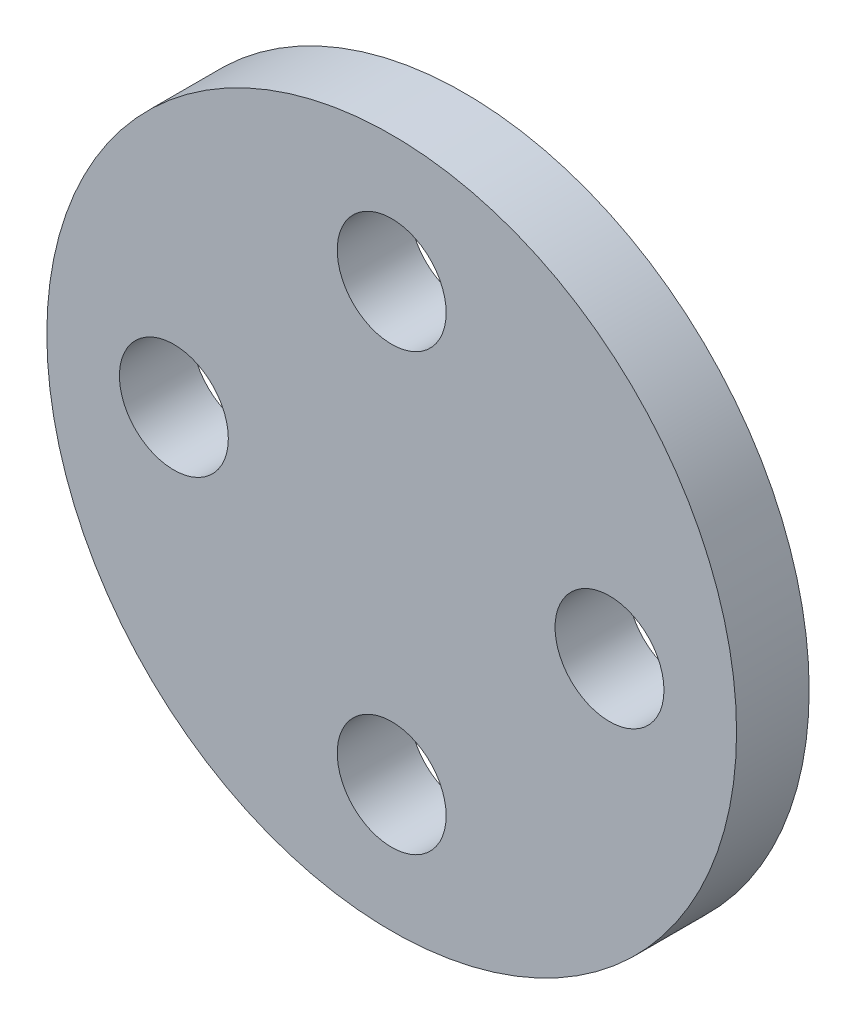
ISO-10303-21;
HEADER;
FILE_DESCRIPTION(('STEP AP214'),'2;1');
FILE_NAME('part.step','',(''),(''),'','','');
FILE_SCHEMA(('AUTOMOTIVE_DESIGN { 1 0 10303 214 1 1 1 1 }'));
ENDSEC;
DATA;
#1=APPLICATION_CONTEXT('core data for automotive mechanical design processes');
#2=APPLICATION_PROTOCOL_DEFINITION('international standard','automotive_design',2000,#1);
#3=PRODUCT_CONTEXT('',#1,'mechanical');
#4=PRODUCT('Part','Part','',(#3));
#5=PRODUCT_RELATED_PRODUCT_CATEGORY('part','',(#4));
#6=PRODUCT_DEFINITION_FORMATION('','',#4);
#7=PRODUCT_DEFINITION_CONTEXT('part definition',#1,'design');
#8=PRODUCT_DEFINITION('design','',#6,#7);
#9=PRODUCT_DEFINITION_SHAPE('','',#8);
#10=(LENGTH_UNIT() NAMED_UNIT(*) SI_UNIT(.MILLI.,.METRE.));
#11=(NAMED_UNIT(*) PLANE_ANGLE_UNIT() SI_UNIT($,.RADIAN.));
#12=(NAMED_UNIT(*) SI_UNIT($,.STERADIAN.) SOLID_ANGLE_UNIT());
#13=UNCERTAINTY_MEASURE_WITH_UNIT(LENGTH_MEASURE(1.E-05),#10,'distance_accuracy_value','');
#14=(GEOMETRIC_REPRESENTATION_CONTEXT(3) GLOBAL_UNCERTAINTY_ASSIGNED_CONTEXT((#13)) GLOBAL_UNIT_ASSIGNED_CONTEXT((#10,
#11,#12)) REPRESENTATION_CONTEXT('',''));
#15=CARTESIAN_POINT('',(0.,0.,0.));
#16=DIRECTION('',(0.,0.,1.));
#17=DIRECTION('',(1.,0.,0.));
#18=AXIS2_PLACEMENT_3D('',#15,#16,#17);
#19=CARTESIAN_POINT('',(0.,0.,3.175));
#20=DIRECTION('',(0.,0.,1.));
#21=DIRECTION('',(1.,0.,0.));
#22=AXIS2_PLACEMENT_3D('',#19,#20,#21);
#23=PLANE('',#22);
#24=CARTESIAN_POINT('',(5.39100612496821E-13,-9.525,3.175));
#25=DIRECTION('',(0.,0.,1.));
#26=DIRECTION('',(1.,0.,0.));
#27=AXIS2_PLACEMENT_3D('',#24,#25,#26);
#28=CIRCLE('',#27,2.38125000000058);
#29=CARTESIAN_POINT('',(2.38125000000112,-9.525,3.175));
#30=VERTEX_POINT('',#29);
#31=EDGE_CURVE('E53',#30,#30,#28,.T.);
#32=ORIENTED_EDGE('',*,*,#31,.F.);
#33=EDGE_LOOP('',(#32));
#34=FACE_BOUND('',#33,.T.);
#35=CARTESIAN_POINT('',(0.,9.525,3.175));
#36=DIRECTION('',(0.,0.,1.));
#37=DIRECTION('',(1.,0.,0.));
#38=AXIS2_PLACEMENT_3D('',#35,#36,#37);
#39=CIRCLE('',#38,2.38125);
#40=CARTESIAN_POINT('',(2.38125,9.525,3.175));
#41=VERTEX_POINT('',#40);
#42=EDGE_CURVE('E42',#41,#41,#39,.T.);
#43=ORIENTED_EDGE('',*,*,#42,.F.);
#44=EDGE_LOOP('',(#43));
#45=FACE_BOUND('',#44,.T.);
#46=CARTESIAN_POINT('',(0.,0.,3.175));
#47=DIRECTION('',(0.,0.,1.));
#48=DIRECTION('',(1.,0.,0.));
#49=AXIS2_PLACEMENT_3D('',#46,#47,#48);
#50=CIRCLE('',#49,15.08125);
#51=CARTESIAN_POINT('',(15.08125,0.,3.175));
#52=VERTEX_POINT('',#51);
#53=EDGE_CURVE('E10',#52,#52,#50,.T.);
#54=ORIENTED_EDGE('',*,*,#53,.T.);
#55=EDGE_LOOP('',(#54));
#56=FACE_BOUND('',#55,.T.);
#57=CARTESIAN_POINT('',(9.52500000000027,2.6955030624841E-13,3.175));
#58=DIRECTION('',(0.,0.,1.));
#59=DIRECTION('',(1.,0.,0.));
#60=AXIS2_PLACEMENT_3D('',#57,#58,#59);
#61=CIRCLE('',#60,2.38125000000021);
#62=CARTESIAN_POINT('',(11.9062500000005,2.6955030624841E-13,3.175));
#63=VERTEX_POINT('',#62);
#64=EDGE_CURVE('E47',#63,#63,#61,.T.);
#65=ORIENTED_EDGE('',*,*,#64,.F.);
#66=EDGE_LOOP('',(#65));
#67=FACE_BOUND('',#66,.T.);
#68=CARTESIAN_POINT('',(-9.52499999999973,-2.70716782324598E-13,3.175));
#69=DIRECTION('',(0.,0.,1.));
#70=DIRECTION('',(1.,0.,0.));
#71=AXIS2_PLACEMENT_3D('',#68,#69,#70);
#72=CIRCLE('',#71,2.38125000000043);
#73=CARTESIAN_POINT('',(-7.1437499999993,-2.70716782324598E-13,3.175));
#74=VERTEX_POINT('',#73);
#75=EDGE_CURVE('E59',#74,#74,#72,.T.);
#76=ORIENTED_EDGE('',*,*,#75,.F.);
#77=EDGE_LOOP('',(#76));
#78=FACE_BOUND('',#77,.T.);
#79=ADVANCED_FACE('F31',(#34,#45,#56,#67,#78),#23,.T.);
#80=CARTESIAN_POINT('',(0.,0.,0.));
#81=DIRECTION('',(0.,0.,1.));
#82=DIRECTION('',(1.,0.,0.));
#83=AXIS2_PLACEMENT_3D('',#80,#81,#82);
#84=PLANE('',#83);
#85=CARTESIAN_POINT('',(0.,0.,0.));
#86=DIRECTION('',(0.,0.,1.));
#87=DIRECTION('',(1.,0.,0.));
#88=AXIS2_PLACEMENT_3D('',#85,#86,#87);
#89=CIRCLE('',#88,15.08125);
#90=CARTESIAN_POINT('',(15.08125,0.,0.));
#91=VERTEX_POINT('',#90);
#92=EDGE_CURVE('E35',#91,#91,#89,.T.);
#93=ORIENTED_EDGE('',*,*,#92,.F.);
#94=EDGE_LOOP('',(#93));
#95=FACE_BOUND('',#94,.T.);
#96=CARTESIAN_POINT('',(0.,9.525,0.));
#97=DIRECTION('',(0.,0.,1.));
#98=DIRECTION('',(1.,0.,0.));
#99=AXIS2_PLACEMENT_3D('',#96,#97,#98);
#100=CIRCLE('',#99,2.38125);
#101=CARTESIAN_POINT('',(2.38125,9.525,0.));
#102=VERTEX_POINT('',#101);
#103=EDGE_CURVE('E44',#102,#102,#100,.T.);
#104=ORIENTED_EDGE('',*,*,#103,.T.);
#105=EDGE_LOOP('',(#104));
#106=FACE_BOUND('',#105,.T.);
#107=CARTESIAN_POINT('',(9.52500000000027,2.6955030624841E-13,0.));
#108=DIRECTION('',(0.,0.,1.));
#109=DIRECTION('',(1.,0.,0.));
#110=AXIS2_PLACEMENT_3D('',#107,#108,#109);
#111=CIRCLE('',#110,2.38125000000021);
#112=CARTESIAN_POINT('',(11.9062500000005,2.6955030624841E-13,0.));
#113=VERTEX_POINT('',#112);
#114=EDGE_CURVE('E50',#113,#113,#111,.T.);
#115=ORIENTED_EDGE('',*,*,#114,.T.);
#116=EDGE_LOOP('',(#115));
#117=FACE_BOUND('',#116,.T.);
#118=CARTESIAN_POINT('',(5.39100612496821E-13,-9.525,0.));
#119=DIRECTION('',(0.,0.,1.));
#120=DIRECTION('',(1.,0.,0.));
#121=AXIS2_PLACEMENT_3D('',#118,#119,#120);
#122=CIRCLE('',#121,2.38125000000058);
#123=CARTESIAN_POINT('',(2.38125000000112,-9.525,0.));
#124=VERTEX_POINT('',#123);
#125=EDGE_CURVE('E56',#124,#124,#122,.T.);
#126=ORIENTED_EDGE('',*,*,#125,.T.);
#127=EDGE_LOOP('',(#126));
#128=FACE_BOUND('',#127,.T.);
#129=CARTESIAN_POINT('',(-9.52499999999973,-2.70716782324598E-13,0.));
#130=DIRECTION('',(0.,0.,1.));
#131=DIRECTION('',(1.,0.,0.));
#132=AXIS2_PLACEMENT_3D('',#129,#130,#131);
#133=CIRCLE('',#132,2.38125000000043);
#134=CARTESIAN_POINT('',(-7.1437499999993,-2.70716782324598E-13,0.));
#135=VERTEX_POINT('',#134);
#136=EDGE_CURVE('E62',#135,#135,#133,.T.);
#137=ORIENTED_EDGE('',*,*,#136,.T.);
#138=EDGE_LOOP('',(#137));
#139=FACE_BOUND('',#138,.T.);
#140=ADVANCED_FACE('F72',(#95,#106,#117,#128,#139),#84,.F.);
#141=CARTESIAN_POINT('',(0.,0.,3.175));
#142=DIRECTION('',(0.,0.,-1.));
#143=DIRECTION('',(-1.,0.,0.));
#144=AXIS2_PLACEMENT_3D('',#141,#142,#143);
#145=CYLINDRICAL_SURFACE('',#144,15.08125);
#146=ORIENTED_EDGE('',*,*,#53,.F.);
#147=EDGE_LOOP('',(#146));
#148=FACE_BOUND('',#147,.T.);
#149=ORIENTED_EDGE('',*,*,#92,.T.);
#150=EDGE_LOOP('',(#149));
#151=FACE_BOUND('',#150,.T.);
#152=ADVANCED_FACE('F33',(#148,#151),#145,.T.);
#153=CARTESIAN_POINT('',(0.,9.525,3.175));
#154=DIRECTION('',(0.,0.,-1.));
#155=DIRECTION('',(-1.,0.,0.));
#156=AXIS2_PLACEMENT_3D('',#153,#154,#155);
#157=CYLINDRICAL_SURFACE('',#156,2.38125);
#158=ORIENTED_EDGE('',*,*,#42,.T.);
#159=EDGE_LOOP('',(#158));
#160=FACE_BOUND('',#159,.T.);
#161=ORIENTED_EDGE('',*,*,#103,.F.);
#162=EDGE_LOOP('',(#161));
#163=FACE_BOUND('',#162,.T.);
#164=ADVANCED_FACE('F82',(#160,#163),#157,.F.);
#165=CARTESIAN_POINT('',(9.52500000000027,2.6955030624841E-13,3.175));
#166=DIRECTION('',(0.,0.,-1.));
#167=DIRECTION('',(-1.,0.,0.));
#168=AXIS2_PLACEMENT_3D('',#165,#166,#167);
#169=CYLINDRICAL_SURFACE('',#168,2.38125000000021);
#170=ORIENTED_EDGE('',*,*,#64,.T.);
#171=EDGE_LOOP('',(#170));
#172=FACE_BOUND('',#171,.T.);
#173=ORIENTED_EDGE('',*,*,#114,.F.);
#174=EDGE_LOOP('',(#173));
#175=FACE_BOUND('',#174,.T.);
#176=ADVANCED_FACE('F85',(#172,#175),#169,.F.);
#177=CARTESIAN_POINT('',(5.39100612496821E-13,-9.525,3.175));
#178=DIRECTION('',(0.,0.,-1.));
#179=DIRECTION('',(-1.,0.,0.));
#180=AXIS2_PLACEMENT_3D('',#177,#178,#179);
#181=CYLINDRICAL_SURFACE('',#180,2.38125000000058);
#182=ORIENTED_EDGE('',*,*,#31,.T.);
#183=EDGE_LOOP('',(#182));
#184=FACE_BOUND('',#183,.T.);
#185=ORIENTED_EDGE('',*,*,#125,.F.);
#186=EDGE_LOOP('',(#185));
#187=FACE_BOUND('',#186,.T.);
#188=ADVANCED_FACE('F89',(#184,#187),#181,.F.);
#189=CARTESIAN_POINT('',(-9.52499999999973,-2.70716782324598E-13,3.175));
#190=DIRECTION('',(0.,0.,-1.));
#191=DIRECTION('',(-1.,0.,0.));
#192=AXIS2_PLACEMENT_3D('',#189,#190,#191);
#193=CYLINDRICAL_SURFACE('',#192,2.38125000000043);
#194=ORIENTED_EDGE('',*,*,#75,.T.);
#195=EDGE_LOOP('',(#194));
#196=FACE_BOUND('',#195,.T.);
#197=ORIENTED_EDGE('',*,*,#136,.F.);
#198=EDGE_LOOP('',(#197));
#199=FACE_BOUND('',#198,.T.);
#200=ADVANCED_FACE('F68',(#196,#199),#193,.F.);
#201=CLOSED_SHELL('',(#79,#140,#152,#164,#176,#188,#200));
#202=MANIFOLD_SOLID_BREP('B2',#201);
#203=ADVANCED_BREP_SHAPE_REPRESENTATION('',(#18,#202),#14);
#204=SHAPE_DEFINITION_REPRESENTATION(#9,#203);
ENDSEC;
END-ISO-10303-21;
